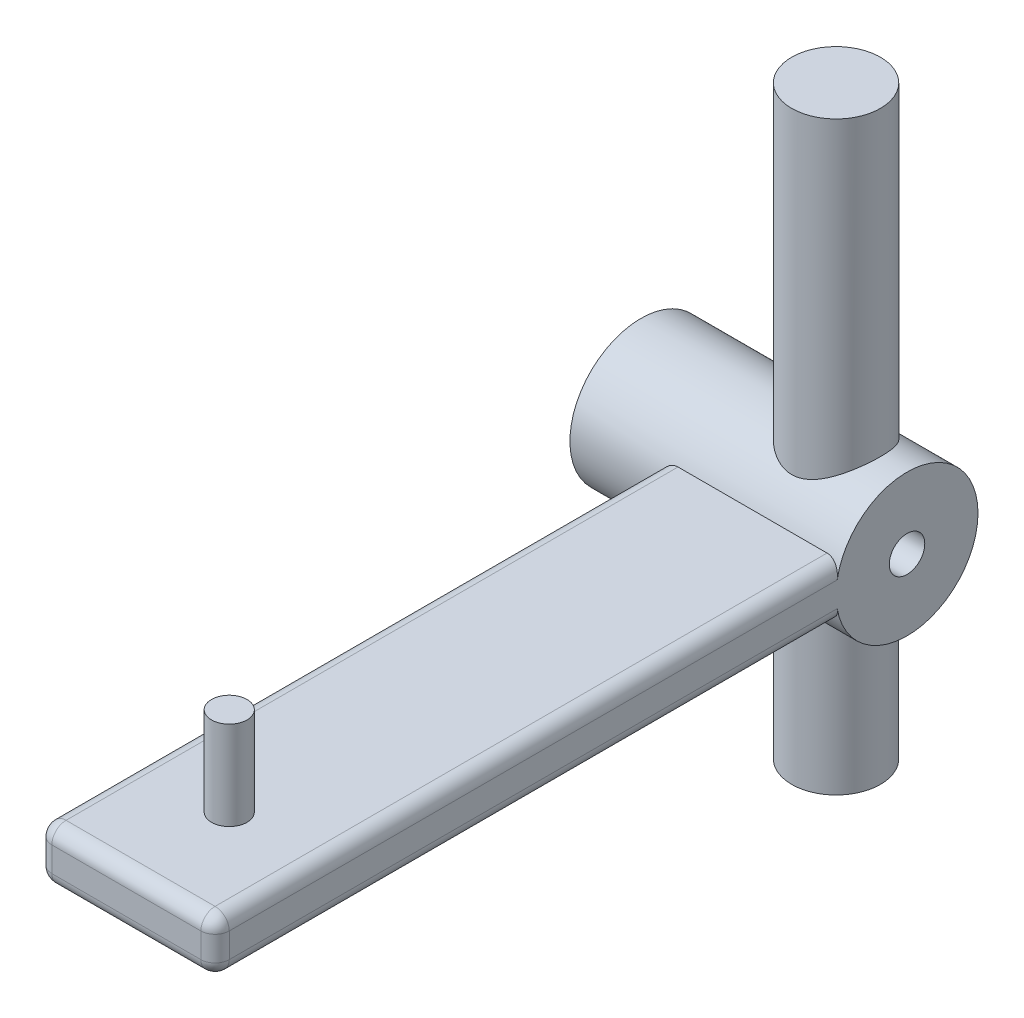
ISO-10303-21;
HEADER;
FILE_DESCRIPTION(('STEP AP214'),'2;1');
FILE_NAME('part.step','',(''),(''),'','','');
FILE_SCHEMA(('AUTOMOTIVE_DESIGN { 1 0 10303 214 1 1 1 1 }'));
ENDSEC;
DATA;
#1=APPLICATION_CONTEXT('core data for automotive mechanical design processes');
#2=APPLICATION_PROTOCOL_DEFINITION('international standard','automotive_design',2000,#1);
#3=PRODUCT_CONTEXT('',#1,'mechanical');
#4=PRODUCT('Part','Part','',(#3));
#5=PRODUCT_RELATED_PRODUCT_CATEGORY('part','',(#4));
#6=PRODUCT_DEFINITION_FORMATION('','',#4);
#7=PRODUCT_DEFINITION_CONTEXT('part definition',#1,'design');
#8=PRODUCT_DEFINITION('design','',#6,#7);
#9=PRODUCT_DEFINITION_SHAPE('','',#8);
#10=(LENGTH_UNIT() NAMED_UNIT(*) SI_UNIT(.MILLI.,.METRE.));
#11=(NAMED_UNIT(*) PLANE_ANGLE_UNIT() SI_UNIT($,.RADIAN.));
#12=(NAMED_UNIT(*) SI_UNIT($,.STERADIAN.) SOLID_ANGLE_UNIT());
#13=UNCERTAINTY_MEASURE_WITH_UNIT(LENGTH_MEASURE(1.E-05),#10,'distance_accuracy_value','');
#14=(GEOMETRIC_REPRESENTATION_CONTEXT(3) GLOBAL_UNCERTAINTY_ASSIGNED_CONTEXT((#13)) GLOBAL_UNIT_ASSIGNED_CONTEXT((#10,
#11,#12)) REPRESENTATION_CONTEXT('',''));
#15=CARTESIAN_POINT('',(0.,0.,0.));
#16=DIRECTION('',(0.,0.,1.));
#17=DIRECTION('',(1.,0.,0.));
#18=AXIS2_PLACEMENT_3D('',#15,#16,#17);
#19=CARTESIAN_POINT('',(15.,0.,0.));
#20=DIRECTION('',(-1.,0.,0.));
#21=DIRECTION('',(0.,0.,1.));
#22=AXIS2_PLACEMENT_3D('',#19,#20,#21);
#23=CYLINDRICAL_SURFACE('',#22,4.);
#24=CARTESIAN_POINT('',(11.,-3.1224989991992,2.5));
#25=CARTESIAN_POINT('',(10.9378432485545,-3.12249991555421,2.4999994109714));
#26=CARTESIAN_POINT('',(10.8756740533292,-3.12436490733917,2.49767581942174));
#27=CARTESIAN_POINT('',(10.7518828204523,-3.13172923119025,2.48843349840857));
#28=CARTESIAN_POINT('',(10.6902611267429,-3.13723070381364,2.48151206248434));
#29=CARTESIAN_POINT('',(10.5067739522563,-3.15888953558504,2.45397595058365));
#30=CARTESIAN_POINT('',(10.386451668811,-3.18020036271142,2.42658990946459));
#31=CARTESIAN_POINT('',(10.1544018021218,-3.23299770760367,2.35576217141198));
#32=CARTESIAN_POINT('',(10.0426095849449,-3.26439575383209,2.31245961359202));
#33=CARTESIAN_POINT('',(9.82799147466594,-3.33366000884439,2.21143916430899));
#34=CARTESIAN_POINT('',(9.72516582624691,-3.37152639405534,2.15372087963018));
#35=CARTESIAN_POINT('',(9.51626601869634,-3.45559225121876,2.01647682425578));
#36=CARTESIAN_POINT('',(9.41160667499548,-3.50222814511578,1.93506425666949));
#37=CARTESIAN_POINT('',(9.2162384483762,-3.59505503533367,1.75662526657432));
#38=CARTESIAN_POINT('',(9.12554172004638,-3.64124561158438,1.65958538899782));
#39=CARTESIAN_POINT('',(8.94977970182732,-3.73459524771314,1.43833990582854));
#40=CARTESIAN_POINT('',(8.86671381554956,-3.78119887781505,1.31226934259652));
#41=CARTESIAN_POINT('',(8.75945484526376,-3.84307251838774,1.11163395543429));
#42=CARTESIAN_POINT('',(8.72658486166689,-3.86236283092052,1.04281240974104));
#43=CARTESIAN_POINT('',(8.66704531463672,-3.89770436975436,0.901758767615551));
#44=CARTESIAN_POINT('',(8.64037146896158,-3.91375783207118,0.829529068393799));
#45=CARTESIAN_POINT('',(8.59601618474372,-3.94066759113823,0.689700297916578));
#46=CARTESIAN_POINT('',(8.57769802348189,-3.95188535984466,0.62237198127859));
#47=CARTESIAN_POINT('',(8.54669771368664,-3.97096241909162,0.485997575898809));
#48=CARTESIAN_POINT('',(8.53401231078379,-3.97882364879721,0.416952503441684));
#49=CARTESIAN_POINT('',(8.51448620236546,-3.99095470334737,0.277765449857175));
#50=CARTESIAN_POINT('',(8.50764188348659,-3.99522674847834,0.207624174243907));
#51=CARTESIAN_POINT('',(8.49990078661077,-4.00006125072438,0.0669114466599394));
#52=CARTESIAN_POINT('',(8.49900332403665,-4.00062413482248,-0.0036599548602787));
#53=CARTESIAN_POINT('',(8.50472537354725,-3.99704479619503,-0.196045081555538));
#54=CARTESIAN_POINT('',(8.51730650307888,-3.98917040897436,-0.317681845488536));
#55=CARTESIAN_POINT('',(8.55973021796612,-3.96290903275931,-0.556636494620256));
#56=CARTESIAN_POINT('',(8.58957410797362,-3.94452124920477,-0.673954052677426));
#57=CARTESIAN_POINT('',(8.66520855928325,-3.89876170711609,-0.901771991763868));
#58=CARTESIAN_POINT('',(8.71103991957106,-3.87136697381047,-1.01225407159607));
#59=CARTESIAN_POINT('',(8.81693723898429,-3.80971291751354,-1.22404012071223));
#60=CARTESIAN_POINT('',(8.87700644106365,-3.77545203089318,-1.32534199174245));
#61=CARTESIAN_POINT('',(9.01805641692367,-3.69786441247167,-1.52942649744659));
#62=CARTESIAN_POINT('',(9.10070927669048,-3.65394006381521,-1.63082454612907));
#63=CARTESIAN_POINT('',(9.28026473720707,-3.56390927740507,-1.81919733573063));
#64=CARTESIAN_POINT('',(9.37718804638397,-3.51779973570409,-1.90615071842624));
#65=CARTESIAN_POINT('',(9.59741125317348,-3.42142883464466,-2.07470887167909));
#66=CARTESIAN_POINT('',(9.72250276335808,-3.37141162686597,-2.15413229677844));
#67=CARTESIAN_POINT('',(9.9872922373014,-3.28028278192382,-2.29052307550563));
#68=CARTESIAN_POINT('',(10.1269626874531,-3.23915480386931,-2.34753179448504));
#69=CARTESIAN_POINT('',(10.3795388061062,-3.18183753131763,-2.42437133527931));
#70=CARTESIAN_POINT('',(10.4898219252135,-3.16193408602513,-2.45003683445404));
#71=CARTESIAN_POINT('',(10.7142303775599,-3.13358277759547,-2.48620337073091));
#72=CARTESIAN_POINT('',(10.8283502426568,-3.12511926504439,-2.49672512520811));
#73=CARTESIAN_POINT('',(11.0574573605024,-3.12092267030677,-2.50197072095181));
#74=CARTESIAN_POINT('',(11.1724460004785,-3.12521876170185,-2.49665835896695));
#75=CARTESIAN_POINT('',(11.3995611643185,-3.14592085836188,-2.47051466367814));
#76=CARTESIAN_POINT('',(11.5116852383712,-3.16233689222906,-2.44967047849126));
#77=CARTESIAN_POINT('',(11.7284367594257,-3.20460120797143,-2.39409874195038));
#78=CARTESIAN_POINT('',(11.8331573158943,-3.23028954367817,-2.35960571424758));
#79=CARTESIAN_POINT('',(12.0355746998938,-3.28831148388749,-2.27804893702243));
#80=CARTESIAN_POINT('',(12.133269018878,-3.32064744602081,-2.23098072583747));
#81=CARTESIAN_POINT('',(12.3386119416632,-3.39574401285203,-2.11530798730694));
#82=CARTESIAN_POINT('',(12.4446145273018,-3.43931724293015,-2.04430931160544));
#83=CARTESIAN_POINT('',(12.6443706606543,-3.52787943213338,-1.8873786892149));
#84=CARTESIAN_POINT('',(12.7381113212423,-3.57286982004467,-1.8014312490262));
#85=CARTESIAN_POINT('',(12.925964070641,-3.66766209459504,-1.60076932492121));
#86=CARTESIAN_POINT('',(13.0177273984849,-3.71707933883201,-1.48365201617177));
#87=CARTESIAN_POINT('',(13.1801470147197,-3.80768973398606,-1.2325678740781));
#88=CARTESIAN_POINT('',(13.2508131951269,-3.84888673619009,-1.09860897940974));
#89=CARTESIAN_POINT('',(13.336581067975,-3.89988966499776,-0.891930804655084));
#90=CARTESIAN_POINT('',(13.3612974439513,-3.91477055097245,-0.824318196039423));
#91=CARTESIAN_POINT('',(13.4049382767323,-3.94124643918619,-0.686640792876425));
#92=CARTESIAN_POINT('',(13.4238660861509,-3.95284334314805,-0.616577444051137));
#93=CARTESIAN_POINT('',(13.4556058301393,-3.9723851203995,-0.474639231464264));
#94=CARTESIAN_POINT('',(13.4684230995164,-3.98033317908836,-0.402766005755507));
#95=CARTESIAN_POINT('',(13.4877391722929,-3.99234168343343,-0.257881807142461));
#96=CARTESIAN_POINT('',(13.4942390209308,-3.99640277220024,-0.184871024482535));
#97=CARTESIAN_POINT('',(13.5030715155071,-4.00191521492706,0.0131102774248925));
#98=CARTESIAN_POINT('',(13.4992657929094,-3.99952706123947,0.13853907920545));
#99=CARTESIAN_POINT('',(13.4730824104545,-3.98321975018363,0.386583137102132));
#100=CARTESIAN_POINT('',(13.4507055933212,-3.96930111604857,0.509198520626831));
#101=CARTESIAN_POINT('',(13.3896775844539,-3.93192083384285,0.744080605483849));
#102=CARTESIAN_POINT('',(13.3516179264353,-3.90880701054803,0.856558752631811));
#103=CARTESIAN_POINT('',(13.2608805375565,-3.85489971248843,1.07343034721918));
#104=CARTESIAN_POINT('',(13.2082003404328,-3.82410494215309,1.17782242685802));
#105=CARTESIAN_POINT('',(13.08367872128,-3.75350673935648,1.38731297754797));
#106=CARTESIAN_POINT('',(13.0104160092425,-3.71310001864657,1.4913601218378));
#107=CARTESIAN_POINT('',(12.8498467674859,-3.62867283985206,1.68643334934802));
#108=CARTESIAN_POINT('',(12.7625243911657,-3.58464833191203,1.77744451843681));
#109=CARTESIAN_POINT('',(12.5617674849381,-3.49000828219719,1.95744716561589));
#110=CARTESIAN_POINT('',(12.4463833874286,-3.43935738427104,2.04425661250063));
#111=CARTESIAN_POINT('',(12.2007105902402,-3.34349647457112,2.19754648509904));
#112=CARTESIAN_POINT('',(12.0704301888475,-3.2982834620419,2.26403815415028));
#113=CARTESIAN_POINT('',(11.8271946992151,-3.22859539780091,2.3619822941284));
#114=CARTESIAN_POINT('',(11.7167294278464,-3.20174639338769,2.39792458576829));
#115=CARTESIAN_POINT('',(11.4900606569982,-3.1587835810451,2.45425618419746));
#116=CARTESIAN_POINT('',(11.3738765802003,-3.14263581150428,2.47469472410168));
#117=CARTESIAN_POINT('',(11.2139400053539,-3.12952857640607,2.49119847139522));
#118=CARTESIAN_POINT('',(11.1712744742913,-3.1268999430677,2.4944943383796));
#119=CARTESIAN_POINT('',(11.0857413010483,-3.12338461939862,2.49889558125807));
#120=CARTESIAN_POINT('',(11.0428736107566,-3.12249836712871,2.50000040629188));
#121=CARTESIAN_POINT('',(11.,-3.1224989991992,2.5));
#122=B_SPLINE_CURVE_WITH_KNOTS('',3,(#24,#25,#26,#27,#28,#29,#30,#31,#32,#33,#34,#35,#36,#37,
#38,#39,#40,#41,#42,#43,#44,#45,#46,#47,#48,#49,#50,#51,#52,#53,#54,#55,#56,#57,#58,#59,#60,#61,
#62,#63,#64,#65,#66,#67,#68,#69,#70,#71,#72,#73,#74,#75,#76,#77,#78,#79,#80,#81,#82,#83,#84,#85,
#86,#87,#88,#89,#90,#91,#92,#93,#94,#95,#96,#97,#98,#99,#100,#101,#102,#103,#104,#105,#106,#107,
#108,#109,#110,#111,#112,#113,#114,#115,#116,#117,#118,#119,#120,#121),.UNSPECIFIED.,.T.,.F.,(4,
2,2,2,2,2,2,2,2,2,2,2,2,2,2,2,2,2,2,2,2,2,2,2,2,2,2,2,2,2,2,2,2,2,2,2,2,2,2,2,2,2,2,2,2,2,2,2,
4),(0.,0.186415315858459,0.372940459994496,0.746478880764687,1.11682668423133,1.48718459072605,
1.90722798685071,2.32763499192879,2.7987602926597,3.03445880867314,3.26999394209509,
3.48170145743206,3.69328649746504,3.90474055342595,4.11617026725867,4.48184709708114,
4.8475515669392,5.21419620193005,5.58092442797435,5.99329080205308,6.40626158573465,
6.87316206383506,7.33919680735487,7.68265621505466,8.02564530559509,8.36941921026408,
8.71347788865091,9.05186495232126,9.39037223519201,9.79332737765188,10.1967026751544,
10.6647326786671,11.1325428866819,11.3527929661039,11.5729152387447,11.7928449800804,
12.0127383271002,12.3871595324234,12.7615637480926,13.1229788842094,13.4844550226785,
13.8834503840958,14.2828986410983,14.7399238503459,15.1966956936287,15.5530255473292,
15.9082190611887,16.0367696833385,16.1653526209168),.UNSPECIFIED.);
#123=CARTESIAN_POINT('',(11.,-3.1224989991992,2.5));
#124=VERTEX_POINT('',#123);
#125=EDGE_CURVE('E43',#124,#124,#122,.T.);
#126=ORIENTED_EDGE('',*,*,#125,.F.);
#127=EDGE_LOOP('',(#126));
#128=FACE_BOUND('',#127,.T.);
#129=CARTESIAN_POINT('',(11.,3.1224989991992,2.5));
#130=CARTESIAN_POINT('',(11.0621567514455,3.12249991555421,2.4999994109714));
#131=CARTESIAN_POINT('',(11.1243259466708,3.12436490733916,2.49767581942174));
#132=CARTESIAN_POINT('',(11.2481171795477,3.13172923119025,2.48843349840857));
#133=CARTESIAN_POINT('',(11.3097388732571,3.13723070381364,2.48151206248434));
#134=CARTESIAN_POINT('',(11.4932260477437,3.15888953558504,2.45397595058365));
#135=CARTESIAN_POINT('',(11.613548331189,3.18020036271142,2.4265899094646));
#136=CARTESIAN_POINT('',(11.8455981978782,3.23299770760367,2.35576217141198));
#137=CARTESIAN_POINT('',(11.9573904150551,3.26439575383209,2.31245961359202));
#138=CARTESIAN_POINT('',(12.1720085253341,3.33366000884439,2.21143916430899));
#139=CARTESIAN_POINT('',(12.2748341737531,3.37152639405534,2.15372087963018));
#140=CARTESIAN_POINT('',(12.4837339813037,3.45559225121876,2.01647682425578));
#141=CARTESIAN_POINT('',(12.5883933250045,3.50222814511578,1.93506425666949));
#142=CARTESIAN_POINT('',(12.7837615516238,3.59505503533367,1.75662526657432));
#143=CARTESIAN_POINT('',(12.8744582799536,3.64124561158438,1.65958538899782));
#144=CARTESIAN_POINT('',(13.0502202981727,3.73459524771314,1.43833990582854));
#145=CARTESIAN_POINT('',(13.1332861844504,3.78119887781505,1.31226934259652));
#146=CARTESIAN_POINT('',(13.2405451547362,3.84307251838774,1.11163395543429));
#147=CARTESIAN_POINT('',(13.2734151383331,3.86236283092052,1.04281240974104));
#148=CARTESIAN_POINT('',(13.3329546853633,3.89770436975436,0.901758767615551));
#149=CARTESIAN_POINT('',(13.3596285310384,3.91375783207118,0.829529068393799));
#150=CARTESIAN_POINT('',(13.4039838152563,3.94066759113823,0.689700297916579));
#151=CARTESIAN_POINT('',(13.4223019765181,3.95188535984466,0.622371981278591));
#152=CARTESIAN_POINT('',(13.4533022863134,3.97096241909162,0.485997575898811));
#153=CARTESIAN_POINT('',(13.4659876892162,3.97882364879721,0.416952503441685));
#154=CARTESIAN_POINT('',(13.4855137976345,3.99095470334737,0.277765449857176));
#155=CARTESIAN_POINT('',(13.4923581165134,3.99522674847834,0.207624174243907));
#156=CARTESIAN_POINT('',(13.5000992133892,4.00006125072438,0.0669114466599402));
#157=CARTESIAN_POINT('',(13.5009966759634,4.00062413482248,-0.00365995486027784));
#158=CARTESIAN_POINT('',(13.4952746264528,3.99704479619503,-0.196045081555537));
#159=CARTESIAN_POINT('',(13.4826934969211,3.98917040897436,-0.317681845488535));
#160=CARTESIAN_POINT('',(13.4402697820339,3.96290903275931,-0.556636494620255));
#161=CARTESIAN_POINT('',(13.4104258920264,3.94452124920478,-0.673954052677426));
#162=CARTESIAN_POINT('',(13.3347914407167,3.89876170711609,-0.901771991763867));
#163=CARTESIAN_POINT('',(13.2889600804289,3.87136697381047,-1.01225407159606));
#164=CARTESIAN_POINT('',(13.1830627610157,3.80971291751354,-1.22404012071223));
#165=CARTESIAN_POINT('',(13.1229935589364,3.77545203089318,-1.32534199174245));
#166=CARTESIAN_POINT('',(12.9819435830763,3.69786441247167,-1.52942649744659));
#167=CARTESIAN_POINT('',(12.8992907233095,3.65394006381521,-1.63082454612907));
#168=CARTESIAN_POINT('',(12.7197352627929,3.56390927740507,-1.81919733573063));
#169=CARTESIAN_POINT('',(12.622811953616,3.51779973570409,-1.90615071842624));
#170=CARTESIAN_POINT('',(12.4025887468265,3.42142883464466,-2.07470887167909));
#171=CARTESIAN_POINT('',(12.2774972366419,3.37141162686597,-2.15413229677844));
#172=CARTESIAN_POINT('',(12.0127077626986,3.28028278192382,-2.29052307550563));
#173=CARTESIAN_POINT('',(11.8730373125469,3.23915480386931,-2.34753179448504));
#174=CARTESIAN_POINT('',(11.6204611938938,3.18183753131763,-2.42437133527931));
#175=CARTESIAN_POINT('',(11.5101780747865,3.16193408602513,-2.45003683445404));
#176=CARTESIAN_POINT('',(11.2857696224401,3.13358277759547,-2.48620337073091));
#177=CARTESIAN_POINT('',(11.1716497573432,3.12511926504439,-2.49672512520811));
#178=CARTESIAN_POINT('',(10.9425426394976,3.12092267030677,-2.50197072095181));
#179=CARTESIAN_POINT('',(10.8275539995215,3.12521876170185,-2.49665835896695));
#180=CARTESIAN_POINT('',(10.6004388356815,3.14592085836188,-2.47051466367814));
#181=CARTESIAN_POINT('',(10.4883147616288,3.16233689222906,-2.44967047849126));
#182=CARTESIAN_POINT('',(10.2715632405743,3.20460120797143,-2.39409874195038));
#183=CARTESIAN_POINT('',(10.1668426841057,3.23028954367817,-2.35960571424758));
#184=CARTESIAN_POINT('',(9.96442530010621,3.28831148388749,-2.27804893702243));
#185=CARTESIAN_POINT('',(9.86673098112203,3.32064744602081,-2.23098072583747));
#186=CARTESIAN_POINT('',(9.66138805833681,3.39574401285203,-2.11530798730694));
#187=CARTESIAN_POINT('',(9.55538547269823,3.43931724293015,-2.04430931160544));
#188=CARTESIAN_POINT('',(9.35562933934573,3.52787943213338,-1.88737868921489));
#189=CARTESIAN_POINT('',(9.26188867875766,3.57286982004467,-1.8014312490262));
#190=CARTESIAN_POINT('',(9.07403592935904,3.66766209459505,-1.60076932492121));
#191=CARTESIAN_POINT('',(8.98227260151509,3.71707933883201,-1.48365201617177));
#192=CARTESIAN_POINT('',(8.81985298528028,3.80768973398606,-1.23256787407809));
#193=CARTESIAN_POINT('',(8.74918680487308,3.84888673619009,-1.09860897940974));
#194=CARTESIAN_POINT('',(8.66341893202501,3.89988966499776,-0.89193080465508));
#195=CARTESIAN_POINT('',(8.63870255604872,3.91477055097245,-0.824318196039419));
#196=CARTESIAN_POINT('',(8.59506172326772,3.94124643918619,-0.686640792876421));
#197=CARTESIAN_POINT('',(8.57613391384908,3.95284334314805,-0.616577444051133));
#198=CARTESIAN_POINT('',(8.54439416986074,3.9723851203995,-0.474639231464261));
#199=CARTESIAN_POINT('',(8.53157690048357,3.98033317908836,-0.402766005755505));
#200=CARTESIAN_POINT('',(8.5122608277071,3.99234168343343,-0.257881807142459));
#201=CARTESIAN_POINT('',(8.50576097906921,3.99640277220024,-0.184871024482533));
#202=CARTESIAN_POINT('',(8.49692848449289,4.00191521492706,0.0131102774248941));
#203=CARTESIAN_POINT('',(8.50073420709059,3.99952706123947,0.138539079205451));
#204=CARTESIAN_POINT('',(8.52691758954553,3.98321975018363,0.386583137102133));
#205=CARTESIAN_POINT('',(8.5492944066788,3.96930111604857,0.509198520626833));
#206=CARTESIAN_POINT('',(8.61032241554611,3.93192083384285,0.744080605483852));
#207=CARTESIAN_POINT('',(8.64838207356467,3.90880701054803,0.856558752631814));
#208=CARTESIAN_POINT('',(8.73911946244348,3.85489971248843,1.07343034721918));
#209=CARTESIAN_POINT('',(8.7917996595672,3.82410494215309,1.17782242685803));
#210=CARTESIAN_POINT('',(8.91632127871996,3.75350673935648,1.38731297754798));
#211=CARTESIAN_POINT('',(8.9895839907575,3.71310001864657,1.4913601218378));
#212=CARTESIAN_POINT('',(9.1501532325141,3.62867283985206,1.68643334934803));
#213=CARTESIAN_POINT('',(9.23747560883428,3.58464833191203,1.77744451843681));
#214=CARTESIAN_POINT('',(9.43823251506187,3.49000828219718,1.95744716561589));
#215=CARTESIAN_POINT('',(9.55361661257142,3.43935738427104,2.04425661250064));
#216=CARTESIAN_POINT('',(9.79928940975976,3.34349647457112,2.19754648509905));
#217=CARTESIAN_POINT('',(9.92956981115252,3.2982834620419,2.26403815415028));
#218=CARTESIAN_POINT('',(10.1728053007849,3.22859539780091,2.36198229412841));
#219=CARTESIAN_POINT('',(10.2832705721536,3.20174639338769,2.3979245857683));
#220=CARTESIAN_POINT('',(10.5099393430018,3.1587835810451,2.45425618419746));
#221=CARTESIAN_POINT('',(10.6261234197997,3.14263581150428,2.47469472410168));
#222=CARTESIAN_POINT('',(10.7860599946461,3.12952857640607,2.49119847139522));
#223=CARTESIAN_POINT('',(10.8287255257087,3.1268999430677,2.4944943383796));
#224=CARTESIAN_POINT('',(10.9142586989517,3.12338461939862,2.49889558125807));
#225=CARTESIAN_POINT('',(10.9571263892434,3.12249836712871,2.50000040629188));
#226=CARTESIAN_POINT('',(11.,3.1224989991992,2.5));
#227=B_SPLINE_CURVE_WITH_KNOTS('',3,(#129,#130,#131,#132,#133,#134,#135,#136,#137,#138,#139,
#140,#141,#142,#143,#144,#145,#146,#147,#148,#149,#150,#151,#152,#153,#154,#155,#156,#157,#158,
#159,#160,#161,#162,#163,#164,#165,#166,#167,#168,#169,#170,#171,#172,#173,#174,#175,#176,#177,
#178,#179,#180,#181,#182,#183,#184,#185,#186,#187,#188,#189,#190,#191,#192,#193,#194,#195,#196,
#197,#198,#199,#200,#201,#202,#203,#204,#205,#206,#207,#208,#209,#210,#211,#212,#213,#214,#215,
#216,#217,#218,#219,#220,#221,#222,#223,#224,#225,#226),.UNSPECIFIED.,.T.,.F.,(4,2,2,2,2,2,2,2,
2,2,2,2,2,2,2,2,2,2,2,2,2,2,2,2,2,2,2,2,2,2,2,2,2,2,2,2,2,2,2,2,2,2,2,2,2,2,2,2,4),(0.,
0.186415315858459,0.372940459994496,0.746478880764687,1.11682668423133,1.48718459072605,
1.90722798685071,2.32763499192879,2.7987602926597,3.03445880867314,3.26999394209509,
3.48170145743206,3.69328649746504,3.90474055342595,4.11617026725867,4.48184709708114,
4.84755156693919,5.21419620193005,5.58092442797435,5.99329080205308,6.40626158573465,
6.87316206383506,7.33919680735487,7.68265621505467,8.02564530559509,8.36941921026408,
8.71347788865091,9.05186495232127,9.39037223519201,9.79332737765188,10.1967026751544,
10.6647326786671,11.1325428866819,11.3527929661039,11.5729152387447,11.7928449800804,
12.0127383271002,12.3871595324234,12.7615637480926,13.1229788842094,13.4844550226785,
13.8834503840959,14.2828986410983,14.7399238503459,15.1966956936287,15.5530255473292,
15.9082190611887,16.0367696833385,16.1653526209168),.UNSPECIFIED.);
#228=CARTESIAN_POINT('',(11.,3.1224989991992,2.5));
#229=VERTEX_POINT('',#228);
#230=EDGE_CURVE('E258',#229,#229,#227,.T.);
#231=ORIENTED_EDGE('',*,*,#230,.F.);
#232=EDGE_LOOP('',(#231));
#233=FACE_BOUND('',#232,.T.);
#234=CARTESIAN_POINT('',(0.,0.,0.));
#235=DIRECTION('',(1.,0.,0.));
#236=DIRECTION('',(0.,0.,-1.));
#237=AXIS2_PLACEMENT_3D('',#234,#235,#236);
#238=CIRCLE('',#237,4.);
#239=CARTESIAN_POINT('',(0.,0.,-4.));
#240=VERTEX_POINT('',#239);
#241=EDGE_CURVE('E313',#240,#240,#238,.T.);
#242=ORIENTED_EDGE('',*,*,#241,.T.);
#243=EDGE_LOOP('',(#242));
#244=FACE_BOUND('',#243,.T.);
#245=DIRECTION('',(-1.,0.,0.));
#246=VECTOR('',#245,1.);
#247=CARTESIAN_POINT('',(15.,1.5,3.70809924354783));
#248=LINE('',#247,#246);
#249=CARTESIAN_POINT('',(14.2,1.5,3.70809924354783));
#250=VERTEX_POINT('',#249);
#251=CARTESIAN_POINT('',(5.8,1.5,3.70809924354783));
#252=VERTEX_POINT('',#251);
#253=EDGE_CURVE('E315',#250,#252,#248,.T.);
#254=ORIENTED_EDGE('',*,*,#253,.F.);
#255=CARTESIAN_POINT('',(15.,0.7,3.93827373350304));
#256=CARTESIAN_POINT('',(15.00003157772,0.746057399138449,3.9301179800702));
#257=CARTESIAN_POINT('',(14.9960258857976,0.791919933036745,3.92110328681089));
#258=CARTESIAN_POINT('',(14.9803588367309,0.881961921379461,3.90181942675969));
#259=CARTESIAN_POINT('',(14.9687114719594,0.926144296163572,3.89155258065569));
#260=CARTESIAN_POINT('',(14.9381838912962,1.01169058580803,3.8701995381054));
#261=CARTESIAN_POINT('',(14.9193068997385,1.05305574744176,3.85911370869303));
#262=CARTESIAN_POINT('',(14.8748698776604,1.13197362371854,3.83670636777501));
#263=CARTESIAN_POINT('',(14.8493073076953,1.16952488215088,3.82538476822184));
#264=CARTESIAN_POINT('',(14.7915279549102,1.24058836091228,3.80294105508851));
#265=CARTESIAN_POINT('',(14.7591829110673,1.27399940690902,3.79182809884115));
#266=CARTESIAN_POINT('',(14.6889567532844,1.33488571743998,3.77082476988019));
#267=CARTESIAN_POINT('',(14.6510752552896,1.36236056986213,3.76093448206906));
#268=CARTESIAN_POINT('',(14.5714787449458,1.41001168712396,3.74332778635944));
#269=CARTESIAN_POINT('',(14.5298458580468,1.43031145292343,3.73557515688311));
#270=CARTESIAN_POINT('',(14.4433668611617,1.46348478454338,3.72270502847047));
#271=CARTESIAN_POINT('',(14.3985257803724,1.47636969911195,3.7175835038112));
#272=CARTESIAN_POINT('',(14.3277042185887,1.49015791918636,3.71206891089618));
#273=CARTESIAN_POINT('',(14.3023185499099,1.4938437850753,3.7105851362699));
#274=CARTESIAN_POINT('',(14.2512938265108,1.49876515548529,3.70859889809295));
#275=CARTESIAN_POINT('',(14.2256549923322,1.50000263111689,3.70809564516465));
#276=CARTESIAN_POINT('',(14.2,1.5,3.70809924354783));
#277=B_SPLINE_CURVE_WITH_KNOTS('',3,(#255,#256,#257,#258,#259,#260,#261,#262,#263,#264,#265,
#266,#267,#268,#269,#270,#271,#272,#273,#274,#275,#276),.UNSPECIFIED.,.F.,.F.,(4,2,2,2,2,2,2,2,
2,2,4),(0.,0.140082306408202,0.279908826688306,0.419673058359881,0.559490455259687,
0.702238898420923,0.844997248514572,0.985162666955398,1.12511298169198,1.20207417653242,
1.2789733874432),.UNSPECIFIED.);
#278=CARTESIAN_POINT('',(15.,0.7,3.93827373350304));
#279=VERTEX_POINT('',#278);
#280=EDGE_CURVE('E318',#279,#250,#277,.T.);
#281=ORIENTED_EDGE('',*,*,#280,.F.);
#282=CARTESIAN_POINT('',(15.,0.,0.));
#283=DIRECTION('',(1.,0.,0.));
#284=DIRECTION('',(0.,0.,-1.));
#285=AXIS2_PLACEMENT_3D('',#282,#283,#284);
#286=CIRCLE('',#285,4.);
#287=CARTESIAN_POINT('',(15.,-0.700000000000001,3.93827373350304));
#288=VERTEX_POINT('',#287);
#289=EDGE_CURVE('E574',#288,#279,#286,.T.);
#290=ORIENTED_EDGE('',*,*,#289,.F.);
#291=CARTESIAN_POINT('',(14.2,-1.5,3.70809924354783));
#292=CARTESIAN_POINT('',(14.2215067926189,-1.50000073352804,3.70809778661657));
#293=CARTESIAN_POINT('',(14.2430025923986,-1.4991321493973,3.70845042333593));
#294=CARTESIAN_POINT('',(14.2858267718489,-1.49567285274098,3.70984742730189));
#295=CARTESIAN_POINT('',(14.3071551954586,-1.49308260860119,3.71089160641082));
#296=CARTESIAN_POINT('',(14.370514093532,-1.48278184734816,3.71502567016665));
#297=CARTESIAN_POINT('',(14.4120980203134,-1.47254098080252,3.71911736223386));
#298=CARTESIAN_POINT('',(14.4927885000183,-1.44571117153796,3.72962779242602));
#299=CARTESIAN_POINT('',(14.5318964495163,-1.42912584526848,3.73604520474161));
#300=CARTESIAN_POINT('',(14.6067597673662,-1.39016517268406,3.75071632174409));
#301=CARTESIAN_POINT('',(14.6425130168298,-1.3677862000954,3.75897117604025));
#302=CARTESIAN_POINT('',(14.7111999715858,-1.31690610145354,3.77710394197983));
#303=CARTESIAN_POINT('',(14.7439666998481,-1.28819820525238,3.78703305394968));
#304=CARTESIAN_POINT('',(14.8043253799727,-1.2259944621487,3.80762528162875));
#305=CARTESIAN_POINT('',(14.8319153980565,-1.19249683422573,3.8182886696041));
#306=CARTESIAN_POINT('',(14.8827532800253,-1.11945301490267,3.84035953031236));
#307=CARTESIAN_POINT('',(14.9056564658015,-1.07966868700776,3.85177428699458));
#308=CARTESIAN_POINT('',(14.94436800161,-0.996666323576232,3.87408054799547));
#309=CARTESIAN_POINT('',(14.9601804904175,-0.953450308470307,3.88497235423147));
#310=CARTESIAN_POINT('',(14.9813684306612,-0.875203805486262,3.90323289951199));
#311=CARTESIAN_POINT('',(14.9883258777497,-0.840646635238305,3.9108266982797));
#312=CARTESIAN_POINT('',(14.9976456259015,-0.770763840123243,3.9252026706308));
#313=CARTESIAN_POINT('',(15.0000090815126,-0.735438410589979,3.93198504773597));
#314=CARTESIAN_POINT('',(15.,-0.700000000000001,3.93827373350304));
#315=B_SPLINE_CURVE_WITH_KNOTS('',3,(#291,#292,#293,#294,#295,#296,#297,#298,#299,#300,#301,
#302,#303,#304,#305,#306,#307,#308,#309,#310,#311,#312,#313,#314),.UNSPECIFIED.,.F.,.F.,(4,2,2,
2,2,2,2,2,2,2,2,4),(0.,0.0644784976977748,0.128939460889541,0.257329137725427,0.385645739062586,
0.514042849430028,0.647507573380535,0.781022054723122,0.922280736105957,1.06345685841978,
1.17133689581842,1.27918981762996),.UNSPECIFIED.);
#316=CARTESIAN_POINT('',(14.2,-1.5,3.70809924354783));
#317=VERTEX_POINT('',#316);
#318=EDGE_CURVE('E219',#317,#288,#315,.T.);
#319=ORIENTED_EDGE('',*,*,#318,.F.);
#320=DIRECTION('',(-1.,0.,0.));
#321=VECTOR('',#320,1.);
#322=CARTESIAN_POINT('',(15.,-1.5,3.70809924354783));
#323=LINE('',#322,#321);
#324=CARTESIAN_POINT('',(5.8,-1.5,3.70809924354783));
#325=VERTEX_POINT('',#324);
#326=EDGE_CURVE('E207',#325,#317,#323,.F.);
#327=ORIENTED_EDGE('',*,*,#326,.F.);
#328=CARTESIAN_POINT('',(5.,-0.700000000000003,3.93827373350304));
#329=CARTESIAN_POINT('',(4.99996842228003,-0.746057399138452,3.9301179800702));
#330=CARTESIAN_POINT('',(5.00397411420245,-0.791919933036747,3.92110328681089));
#331=CARTESIAN_POINT('',(5.01964116326913,-0.881961921379462,3.90181942675969));
#332=CARTESIAN_POINT('',(5.03128852804058,-0.926144296163574,3.89155258065569));
#333=CARTESIAN_POINT('',(5.06181610870384,-1.01169058580803,3.8701995381054));
#334=CARTESIAN_POINT('',(5.08069310026154,-1.05305574744177,3.85911370869303));
#335=CARTESIAN_POINT('',(5.12513012233964,-1.13197362371854,3.83670636777501));
#336=CARTESIAN_POINT('',(5.15069269230468,-1.16952488215088,3.82538476822183));
#337=CARTESIAN_POINT('',(5.20847204508982,-1.24058836091228,3.80294105508851));
#338=CARTESIAN_POINT('',(5.24081708893271,-1.27399940690902,3.79182809884115));
#339=CARTESIAN_POINT('',(5.31104324671558,-1.33488571743998,3.77082476988019));
#340=CARTESIAN_POINT('',(5.34892474471042,-1.36236056986213,3.76093448206906));
#341=CARTESIAN_POINT('',(5.42852125505425,-1.41001168712396,3.74332778635944));
#342=CARTESIAN_POINT('',(5.47015414195316,-1.43031145292343,3.73557515688311));
#343=CARTESIAN_POINT('',(5.55663313883834,-1.46348478454338,3.72270502847047));
#344=CARTESIAN_POINT('',(5.60147421962762,-1.47636969911195,3.7175835038112));
#345=CARTESIAN_POINT('',(5.67229578141132,-1.49015791918636,3.71206891089618));
#346=CARTESIAN_POINT('',(5.69768145009014,-1.4938437850753,3.7105851362699));
#347=CARTESIAN_POINT('',(5.7487061734892,-1.49876515548529,3.70859889809294));
#348=CARTESIAN_POINT('',(5.7743450076678,-1.50000263111689,3.70809564516464));
#349=CARTESIAN_POINT('',(5.8,-1.5,3.70809924354783));
#350=B_SPLINE_CURVE_WITH_KNOTS('',3,(#328,#329,#330,#331,#332,#333,#334,#335,#336,#337,#338,
#339,#340,#341,#342,#343,#344,#345,#346,#347,#348,#349),.UNSPECIFIED.,.F.,.F.,(4,2,2,2,2,2,2,2,
2,2,4),(0.,0.140082306408202,0.279908826688306,0.419673058359881,0.559490455259687,
0.702238898420922,0.844997248514571,0.985162666955397,1.12511298169198,1.20207417653242,
1.2789733874432),.UNSPECIFIED.);
#351=CARTESIAN_POINT('',(5.,-0.700000000000003,3.93827373350304));
#352=VERTEX_POINT('',#351);
#353=EDGE_CURVE('E197',#352,#325,#350,.T.);
#354=ORIENTED_EDGE('',*,*,#353,.F.);
#355=CARTESIAN_POINT('',(5.,0.,0.));
#356=DIRECTION('',(-1.,0.,0.));
#357=DIRECTION('',(0.,0.,1.));
#358=AXIS2_PLACEMENT_3D('',#355,#356,#357);
#359=CIRCLE('',#358,4.);
#360=CARTESIAN_POINT('',(5.,0.699999999999998,3.93827373350304));
#361=VERTEX_POINT('',#360);
#362=EDGE_CURVE('E194',#361,#352,#359,.F.);
#363=ORIENTED_EDGE('',*,*,#362,.F.);
#364=CARTESIAN_POINT('',(5.8,1.5,3.70809924354783));
#365=CARTESIAN_POINT('',(5.77849320738113,1.50000073352804,3.70809778661657));
#366=CARTESIAN_POINT('',(5.75699740760135,1.4991321493973,3.70845042333593));
#367=CARTESIAN_POINT('',(5.71417322815106,1.49567285274097,3.70984742730189));
#368=CARTESIAN_POINT('',(5.69284480454142,1.49308260860118,3.71089160641082));
#369=CARTESIAN_POINT('',(5.62948590646802,1.48278184734816,3.71502567016665));
#370=CARTESIAN_POINT('',(5.58790197968659,1.47254098080252,3.71911736223386));
#371=CARTESIAN_POINT('',(5.5072114999817,1.44571117153796,3.72962779242602));
#372=CARTESIAN_POINT('',(5.46810355048368,1.42912584526848,3.73604520474161));
#373=CARTESIAN_POINT('',(5.39324023263384,1.39016517268405,3.7507163217441));
#374=CARTESIAN_POINT('',(5.35748698317021,1.3677862000954,3.75897117604025));
#375=CARTESIAN_POINT('',(5.28880002841422,1.31690610145353,3.77710394197983));
#376=CARTESIAN_POINT('',(5.25603330015186,1.28819820525237,3.78703305394968));
#377=CARTESIAN_POINT('',(5.19567462002726,1.2259944621487,3.80762528162874));
#378=CARTESIAN_POINT('',(5.16808460194347,1.19249683422572,3.8182886696041));
#379=CARTESIAN_POINT('',(5.11724671997468,1.11945301490267,3.84035953031236));
#380=CARTESIAN_POINT('',(5.09434353419854,1.07966868700776,3.85177428699458));
#381=CARTESIAN_POINT('',(5.05563199839,0.996666323576232,3.87408054799547));
#382=CARTESIAN_POINT('',(5.03981950958251,0.953450308470307,3.88497235423147));
#383=CARTESIAN_POINT('',(5.01863156933884,0.875203805486261,3.90323289951199));
#384=CARTESIAN_POINT('',(5.0116741222503,0.840646635238304,3.9108266982797));
#385=CARTESIAN_POINT('',(5.00235437409852,0.770763840123241,3.9252026706308));
#386=CARTESIAN_POINT('',(4.99999091848744,0.735438410589977,3.93198504773597));
#387=CARTESIAN_POINT('',(5.,0.699999999999998,3.93827373350304));
#388=B_SPLINE_CURVE_WITH_KNOTS('',3,(#364,#365,#366,#367,#368,#369,#370,#371,#372,#373,#374,
#375,#376,#377,#378,#379,#380,#381,#382,#383,#384,#385,#386,#387),.UNSPECIFIED.,.F.,.F.,(4,2,2,
2,2,2,2,2,2,2,2,4),(0.,0.0644784976977748,0.128939460889539,0.257329137725425,0.385645739062581,
0.514042849430024,0.64750757338053,0.781022054723119,0.922280736105953,1.06345685841978,
1.17133689581842,1.27918981762996),.UNSPECIFIED.);
#389=EDGE_CURVE('E126',#252,#361,#388,.T.);
#390=ORIENTED_EDGE('',*,*,#389,.F.);
#391=EDGE_LOOP('',(#254,#281,#290,#319,#327,#354,#363,#390));
#392=FACE_BOUND('',#391,.T.);
#393=ADVANCED_FACE('F35',(#128,#233,#244,#392),#23,.T.);
#394=CARTESIAN_POINT('',(15.,0.,0.));
#395=DIRECTION('',(-1.,0.,0.));
#396=DIRECTION('',(0.,0.,1.));
#397=AXIS2_PLACEMENT_3D('',#394,#395,#396);
#398=CYLINDRICAL_SURFACE('',#397,1.);
#399=CARTESIAN_POINT('',(0.,0.,0.));
#400=DIRECTION('',(1.,0.,0.));
#401=DIRECTION('',(0.,0.,-1.));
#402=AXIS2_PLACEMENT_3D('',#399,#400,#401);
#403=CIRCLE('',#402,1.);
#404=CARTESIAN_POINT('',(0.,0.,-1.));
#405=VERTEX_POINT('',#404);
#406=EDGE_CURVE('E264',#405,#405,#403,.T.);
#407=ORIENTED_EDGE('',*,*,#406,.F.);
#408=EDGE_LOOP('',(#407));
#409=FACE_BOUND('',#408,.T.);
#410=CARTESIAN_POINT('',(15.,0.,0.));
#411=DIRECTION('',(1.,0.,0.));
#412=DIRECTION('',(0.,0.,-1.));
#413=AXIS2_PLACEMENT_3D('',#410,#411,#412);
#414=CIRCLE('',#413,1.);
#415=CARTESIAN_POINT('',(15.,0.,-1.));
#416=VERTEX_POINT('',#415);
#417=EDGE_CURVE('E570',#416,#416,#414,.T.);
#418=ORIENTED_EDGE('',*,*,#417,.T.);
#419=EDGE_LOOP('',(#418));
#420=FACE_BOUND('',#419,.T.);
#421=ADVANCED_FACE('F249',(#409,#420),#398,.F.);
#422=CARTESIAN_POINT('',(15.,0.,0.));
#423=DIRECTION('',(1.,0.,0.));
#424=DIRECTION('',(0.,0.,-1.));
#425=AXIS2_PLACEMENT_3D('',#422,#423,#424);
#426=PLANE('',#425);
#427=ORIENTED_EDGE('',*,*,#289,.T.);
#428=DIRECTION('',(0.,0.,-1.));
#429=VECTOR('',#428,1.);
#430=CARTESIAN_POINT('',(15.,0.7,39.));
#431=LINE('',#430,#429);
#432=CARTESIAN_POINT('',(15.,0.7,38.2));
#433=VERTEX_POINT('',#432);
#434=EDGE_CURVE('E153',#279,#433,#431,.F.);
#435=ORIENTED_EDGE('',*,*,#434,.T.);
#436=DIRECTION('',(0.,1.,0.));
#437=VECTOR('',#436,1.);
#438=CARTESIAN_POINT('',(15.,1.5,38.2));
#439=LINE('',#438,#437);
#440=CARTESIAN_POINT('',(15.,-0.700000000000001,38.2));
#441=VERTEX_POINT('',#440);
#442=EDGE_CURVE('E122',#433,#441,#439,.F.);
#443=ORIENTED_EDGE('',*,*,#442,.T.);
#444=DIRECTION('',(0.,0.,1.));
#445=VECTOR('',#444,1.);
#446=CARTESIAN_POINT('',(15.,-0.700000000000001,-4.001));
#447=LINE('',#446,#445);
#448=EDGE_CURVE('E170',#288,#441,#447,.T.);
#449=ORIENTED_EDGE('',*,*,#448,.F.);
#450=EDGE_LOOP('',(#427,#435,#443,#449));
#451=FACE_BOUND('',#450,.T.);
#452=ORIENTED_EDGE('',*,*,#417,.F.);
#453=EDGE_LOOP('',(#452));
#454=FACE_BOUND('',#453,.T.);
#455=ADVANCED_FACE('F303',(#451,#454),#426,.T.);
#456=CARTESIAN_POINT('',(0.,0.,0.));
#457=DIRECTION('',(1.,0.,0.));
#458=DIRECTION('',(0.,0.,-1.));
#459=AXIS2_PLACEMENT_3D('',#456,#457,#458);
#460=PLANE('',#459);
#461=ORIENTED_EDGE('',*,*,#241,.F.);
#462=EDGE_LOOP('',(#461));
#463=FACE_BOUND('',#462,.T.);
#464=ORIENTED_EDGE('',*,*,#406,.T.);
#465=EDGE_LOOP('',(#464));
#466=FACE_BOUND('',#465,.T.);
#467=ADVANCED_FACE('F494',(#463,#466),#460,.F.);
#468=CARTESIAN_POINT('',(11.,-12.,0.));
#469=DIRECTION('',(0.,1.,0.));
#470=DIRECTION('',(0.,0.,1.));
#471=AXIS2_PLACEMENT_3D('',#468,#469,#470);
#472=CYLINDRICAL_SURFACE('',#471,2.5);
#473=ORIENTED_EDGE('',*,*,#230,.T.);
#474=EDGE_LOOP('',(#473));
#475=FACE_BOUND('',#474,.T.);
#476=CARTESIAN_POINT('',(11.,21.,0.));
#477=DIRECTION('',(0.,1.,0.));
#478=DIRECTION('',(0.,0.,1.));
#479=AXIS2_PLACEMENT_3D('',#476,#477,#478);
#480=CIRCLE('',#479,2.5);
#481=CARTESIAN_POINT('',(11.,21.,2.5));
#482=VERTEX_POINT('',#481);
#483=EDGE_CURVE('E226',#482,#482,#480,.T.);
#484=ORIENTED_EDGE('',*,*,#483,.F.);
#485=EDGE_LOOP('',(#484));
#486=FACE_BOUND('',#485,.T.);
#487=ADVANCED_FACE('F247',(#475,#486),#472,.T.);
#488=CARTESIAN_POINT('',(11.,-12.,0.));
#489=DIRECTION('',(0.,-1.,0.));
#490=DIRECTION('',(0.,0.,-1.));
#491=AXIS2_PLACEMENT_3D('',#488,#489,#490);
#492=CIRCLE('',#491,2.5);
#493=CARTESIAN_POINT('',(11.,-12.,-2.5));
#494=VERTEX_POINT('',#493);
#495=EDGE_CURVE('E265',#494,#494,#492,.T.);
#496=ORIENTED_EDGE('',*,*,#495,.F.);
#497=EDGE_LOOP('',(#496));
#498=FACE_BOUND('',#497,.T.);
#499=ORIENTED_EDGE('',*,*,#125,.T.);
#500=EDGE_LOOP('',(#499));
#501=FACE_BOUND('',#500,.T.);
#502=ADVANCED_FACE('F242',(#498,#501),#472,.T.);
#503=CARTESIAN_POINT('',(11.,-12.,0.));
#504=DIRECTION('',(0.,-1.,0.));
#505=DIRECTION('',(0.,0.,-1.));
#506=AXIS2_PLACEMENT_3D('',#503,#504,#505);
#507=PLANE('',#506);
#508=ORIENTED_EDGE('',*,*,#495,.T.);
#509=EDGE_LOOP('',(#508));
#510=FACE_BOUND('',#509,.T.);
#511=ADVANCED_FACE('F238',(#510),#507,.T.);
#512=CARTESIAN_POINT('',(11.,21.,0.));
#513=DIRECTION('',(0.,1.,0.));
#514=DIRECTION('',(0.,0.,1.));
#515=AXIS2_PLACEMENT_3D('',#512,#513,#514);
#516=PLANE('',#515);
#517=ORIENTED_EDGE('',*,*,#483,.T.);
#518=EDGE_LOOP('',(#517));
#519=FACE_BOUND('',#518,.T.);
#520=ADVANCED_FACE('F235',(#519),#516,.T.);
#521=CARTESIAN_POINT('',(5.,0.699999999999998,-4.001));
#522=DIRECTION('',(-1.,0.,0.));
#523=DIRECTION('',(0.,0.,1.));
#524=AXIS2_PLACEMENT_3D('',#521,#522,#523);
#525=PLANE('',#524);
#526=DIRECTION('',(0.,0.,1.));
#527=VECTOR('',#526,1.);
#528=CARTESIAN_POINT('',(5.,-0.700000000000003,-4.001));
#529=LINE('',#528,#527);
#530=CARTESIAN_POINT('',(5.,-0.700000000000003,38.2));
#531=VERTEX_POINT('',#530);
#532=EDGE_CURVE('E271',#352,#531,#529,.T.);
#533=ORIENTED_EDGE('',*,*,#532,.T.);
#534=DIRECTION('',(0.,-1.,0.));
#535=VECTOR('',#534,1.);
#536=CARTESIAN_POINT('',(5.,-1.5,38.2));
#537=LINE('',#536,#535);
#538=CARTESIAN_POINT('',(5.,0.699999999999998,38.2));
#539=VERTEX_POINT('',#538);
#540=EDGE_CURVE('E165',#531,#539,#537,.F.);
#541=ORIENTED_EDGE('',*,*,#540,.T.);
#542=DIRECTION('',(0.,0.,-1.));
#543=VECTOR('',#542,1.);
#544=CARTESIAN_POINT('',(5.,0.699999999999998,39.));
#545=LINE('',#544,#543);
#546=EDGE_CURVE('E162',#539,#361,#545,.T.);
#547=ORIENTED_EDGE('',*,*,#546,.T.);
#548=ORIENTED_EDGE('',*,*,#362,.T.);
#549=EDGE_LOOP('',(#533,#541,#547,#548));
#550=FACE_BOUND('',#549,.T.);
#551=ADVANCED_FACE('F234',(#550),#525,.T.);
#552=CARTESIAN_POINT('',(5.8,-0.700000000000003,-4.001));
#553=DIRECTION('',(0.,0.,1.));
#554=DIRECTION('',(1.,0.,0.));
#555=AXIS2_PLACEMENT_3D('',#552,#553,#554);
#556=CYLINDRICAL_SURFACE('',#555,0.8);
#557=ORIENTED_EDGE('',*,*,#532,.F.);
#558=ORIENTED_EDGE('',*,*,#353,.T.);
#559=DIRECTION('',(0.,0.,1.));
#560=VECTOR('',#559,1.);
#561=CARTESIAN_POINT('',(5.8,-1.5,-4.001));
#562=LINE('',#561,#560);
#563=CARTESIAN_POINT('',(5.8,-1.5,38.2));
#564=VERTEX_POINT('',#563);
#565=EDGE_CURVE('E272',#325,#564,#562,.T.);
#566=ORIENTED_EDGE('',*,*,#565,.T.);
#567=CARTESIAN_POINT('',(5.8,-0.700000000000003,38.2));
#568=DIRECTION('',(0.,0.,1.));
#569=DIRECTION('',(1.,0.,0.));
#570=AXIS2_PLACEMENT_3D('',#567,#568,#569);
#571=CIRCLE('',#570,0.8);
#572=EDGE_CURVE('E146',#531,#564,#571,.T.);
#573=ORIENTED_EDGE('',*,*,#572,.F.);
#574=EDGE_LOOP('',(#557,#558,#566,#573));
#575=FACE_BOUND('',#574,.T.);
#576=ADVANCED_FACE('F209',(#575),#556,.T.);
#577=CARTESIAN_POINT('',(5.8,-1.5,-4.001));
#578=DIRECTION('',(0.,-1.,0.));
#579=DIRECTION('',(1.,0.,0.));
#580=AXIS2_PLACEMENT_3D('',#577,#578,#579);
#581=PLANE('',#580);
#582=ORIENTED_EDGE('',*,*,#565,.F.);
#583=ORIENTED_EDGE('',*,*,#326,.T.);
#584=DIRECTION('',(0.,0.,1.));
#585=VECTOR('',#584,1.);
#586=CARTESIAN_POINT('',(14.2,-1.5,-4.001));
#587=LINE('',#586,#585);
#588=CARTESIAN_POINT('',(14.2,-1.5,38.2));
#589=VERTEX_POINT('',#588);
#590=EDGE_CURVE('E198',#317,#589,#587,.T.);
#591=ORIENTED_EDGE('',*,*,#590,.T.);
#592=DIRECTION('',(1.,0.,0.));
#593=VECTOR('',#592,1.);
#594=CARTESIAN_POINT('',(15.,-1.5,38.2));
#595=LINE('',#594,#593);
#596=EDGE_CURVE('E159',#589,#564,#595,.F.);
#597=ORIENTED_EDGE('',*,*,#596,.T.);
#598=EDGE_LOOP('',(#582,#583,#591,#597));
#599=FACE_BOUND('',#598,.T.);
#600=ADVANCED_FACE('F217',(#599),#581,.T.);
#601=CARTESIAN_POINT('',(14.2,-0.700000000000001,-4.001));
#602=DIRECTION('',(0.,0.,1.));
#603=DIRECTION('',(1.,0.,0.));
#604=AXIS2_PLACEMENT_3D('',#601,#602,#603);
#605=CYLINDRICAL_SURFACE('',#604,0.8);
#606=ORIENTED_EDGE('',*,*,#590,.F.);
#607=ORIENTED_EDGE('',*,*,#318,.T.);
#608=ORIENTED_EDGE('',*,*,#448,.T.);
#609=CARTESIAN_POINT('',(14.2,-0.700000000000001,38.2));
#610=DIRECTION('',(0.,0.,1.));
#611=DIRECTION('',(1.,0.,0.));
#612=AXIS2_PLACEMENT_3D('',#609,#610,#611);
#613=CIRCLE('',#612,0.8);
#614=EDGE_CURVE('E176',#589,#441,#613,.T.);
#615=ORIENTED_EDGE('',*,*,#614,.F.);
#616=EDGE_LOOP('',(#606,#607,#608,#615));
#617=FACE_BOUND('',#616,.T.);
#618=ADVANCED_FACE('F228',(#617),#605,.T.);
#619=CARTESIAN_POINT('',(5.,1.5,39.));
#620=DIRECTION('',(0.,-1.,0.));
#621=DIRECTION('',(1.,0.,0.));
#622=AXIS2_PLACEMENT_3D('',#619,#620,#621);
#623=PLANE('',#622);
#624=CARTESIAN_POINT('',(10.,1.5,33.2));
#625=DIRECTION('',(0.,-1.,0.));
#626=DIRECTION('',(1.,0.,0.));
#627=AXIS2_PLACEMENT_3D('',#624,#625,#626);
#628=CIRCLE('',#627,1.);
#629=CARTESIAN_POINT('',(11.,1.5,33.2));
#630=VERTEX_POINT('',#629);
#631=EDGE_CURVE('E11',#630,#630,#628,.F.);
#632=ORIENTED_EDGE('',*,*,#631,.F.);
#633=EDGE_LOOP('',(#632));
#634=FACE_BOUND('',#633,.T.);
#635=DIRECTION('',(0.,0.,-1.));
#636=VECTOR('',#635,1.);
#637=CARTESIAN_POINT('',(14.2,1.5,39.));
#638=LINE('',#637,#636);
#639=CARTESIAN_POINT('',(14.2,1.5,38.2));
#640=VERTEX_POINT('',#639);
#641=EDGE_CURVE('E50',#640,#250,#638,.T.);
#642=ORIENTED_EDGE('',*,*,#641,.T.);
#643=ORIENTED_EDGE('',*,*,#253,.T.);
#644=DIRECTION('',(0.,0.,-1.));
#645=VECTOR('',#644,1.);
#646=CARTESIAN_POINT('',(5.8,1.5,39.));
#647=LINE('',#646,#645);
#648=CARTESIAN_POINT('',(5.8,1.5,38.2));
#649=VERTEX_POINT('',#648);
#650=EDGE_CURVE('E58',#252,#649,#647,.F.);
#651=ORIENTED_EDGE('',*,*,#650,.T.);
#652=DIRECTION('',(-1.,0.,0.));
#653=VECTOR('',#652,1.);
#654=CARTESIAN_POINT('',(5.,1.5,38.2));
#655=LINE('',#654,#653);
#656=EDGE_CURVE('E168',#649,#640,#655,.F.);
#657=ORIENTED_EDGE('',*,*,#656,.T.);
#658=EDGE_LOOP('',(#642,#643,#651,#657));
#659=FACE_BOUND('',#658,.T.);
#660=ADVANCED_FACE('F232',(#634,#659),#623,.F.);
#661=CARTESIAN_POINT('',(0.,0.,39.));
#662=DIRECTION('',(0.,0.,-1.));
#663=DIRECTION('',(-1.,0.,0.));
#664=AXIS2_PLACEMENT_3D('',#661,#662,#663);
#665=PLANE('',#664);
#666=DIRECTION('',(1.,0.,0.));
#667=VECTOR('',#666,1.);
#668=CARTESIAN_POINT('',(0.,-0.700000000000004,39.));
#669=LINE('',#668,#667);
#670=CARTESIAN_POINT('',(5.8,-0.700000000000003,39.));
#671=VERTEX_POINT('',#670);
#672=CARTESIAN_POINT('',(14.2,-0.700000000000001,39.));
#673=VERTEX_POINT('',#672);
#674=EDGE_CURVE('E150',#671,#673,#669,.T.);
#675=ORIENTED_EDGE('',*,*,#674,.T.);
#676=DIRECTION('',(0.,1.,0.));
#677=VECTOR('',#676,1.);
#678=CARTESIAN_POINT('',(14.2,0.,39.));
#679=LINE('',#678,#677);
#680=CARTESIAN_POINT('',(14.2,0.7,39.));
#681=VERTEX_POINT('',#680);
#682=EDGE_CURVE('E120',#673,#681,#679,.T.);
#683=ORIENTED_EDGE('',*,*,#682,.T.);
#684=DIRECTION('',(-1.,0.,0.));
#685=VECTOR('',#684,1.);
#686=CARTESIAN_POINT('',(0.,0.699999999999996,39.));
#687=LINE('',#686,#685);
#688=CARTESIAN_POINT('',(5.8,0.699999999999997,39.));
#689=VERTEX_POINT('',#688);
#690=EDGE_CURVE('E139',#681,#689,#687,.T.);
#691=ORIENTED_EDGE('',*,*,#690,.T.);
#692=DIRECTION('',(0.,-1.,0.));
#693=VECTOR('',#692,1.);
#694=CARTESIAN_POINT('',(5.8,0.,39.));
#695=LINE('',#694,#693);
#696=EDGE_CURVE('E145',#689,#671,#695,.T.);
#697=ORIENTED_EDGE('',*,*,#696,.T.);
#698=EDGE_LOOP('',(#675,#683,#691,#697));
#699=FACE_BOUND('',#698,.T.);
#700=ADVANCED_FACE('F148',(#699),#665,.F.);
#701=CARTESIAN_POINT('',(5.8,0.,38.2));
#702=DIRECTION('',(0.,-1.,0.));
#703=DIRECTION('',(0.,0.,-1.));
#704=AXIS2_PLACEMENT_3D('',#701,#702,#703);
#705=CYLINDRICAL_SURFACE('',#704,0.8);
#706=CARTESIAN_POINT('',(5.8,0.699999999999998,38.2));
#707=DIRECTION('',(0.,1.,0.));
#708=DIRECTION('',(0.,0.,1.));
#709=AXIS2_PLACEMENT_3D('',#706,#707,#708);
#710=CIRCLE('',#709,0.8);
#711=EDGE_CURVE('E186',#539,#689,#710,.T.);
#712=ORIENTED_EDGE('',*,*,#711,.F.);
#713=ORIENTED_EDGE('',*,*,#540,.F.);
#714=CARTESIAN_POINT('',(5.8,-0.700000000000003,38.2));
#715=DIRECTION('',(0.,-1.,0.));
#716=DIRECTION('',(0.,0.,-1.));
#717=AXIS2_PLACEMENT_3D('',#714,#715,#716);
#718=CIRCLE('',#717,0.8);
#719=EDGE_CURVE('E189',#671,#531,#718,.T.);
#720=ORIENTED_EDGE('',*,*,#719,.F.);
#721=ORIENTED_EDGE('',*,*,#696,.F.);
#722=EDGE_LOOP('',(#712,#713,#720,#721));
#723=FACE_BOUND('',#722,.T.);
#724=ADVANCED_FACE('F215',(#723),#705,.T.);
#725=CARTESIAN_POINT('',(5.8,0.699999999999998,39.));
#726=DIRECTION('',(0.,0.,-1.));
#727=DIRECTION('',(-1.,0.,0.));
#728=AXIS2_PLACEMENT_3D('',#725,#726,#727);
#729=CYLINDRICAL_SURFACE('',#728,0.8);
#730=ORIENTED_EDGE('',*,*,#650,.F.);
#731=ORIENTED_EDGE('',*,*,#389,.T.);
#732=ORIENTED_EDGE('',*,*,#546,.F.);
#733=CARTESIAN_POINT('',(5.8,0.699999999999997,38.2));
#734=DIRECTION('',(0.,0.,1.));
#735=DIRECTION('',(1.,0.,0.));
#736=AXIS2_PLACEMENT_3D('',#733,#734,#735);
#737=CIRCLE('',#736,0.8);
#738=EDGE_CURVE('E183',#649,#539,#737,.T.);
#739=ORIENTED_EDGE('',*,*,#738,.F.);
#740=EDGE_LOOP('',(#730,#731,#732,#739));
#741=FACE_BOUND('',#740,.T.);
#742=ADVANCED_FACE('F432',(#741),#729,.T.);
#743=CARTESIAN_POINT('',(5.8,-0.700000000000003,38.2));
#744=DIRECTION('',(-1.,0.,0.));
#745=DIRECTION('',(0.,0.,1.));
#746=AXIS2_PLACEMENT_3D('',#743,#744,#745);
#747=SPHERICAL_SURFACE('',#746,0.8);
#748=ORIENTED_EDGE('',*,*,#719,.T.);
#749=ORIENTED_EDGE('',*,*,#572,.T.);
#750=CARTESIAN_POINT('',(5.8,-0.700000000000003,38.2));
#751=DIRECTION('',(-1.,0.,0.));
#752=DIRECTION('',(0.,0.,1.));
#753=AXIS2_PLACEMENT_3D('',#750,#751,#752);
#754=CIRCLE('',#753,0.8);
#755=EDGE_CURVE('E180',#671,#564,#754,.F.);
#756=ORIENTED_EDGE('',*,*,#755,.F.);
#757=EDGE_LOOP('',(#748,#749,#756));
#758=FACE_BOUND('',#757,.T.);
#759=ADVANCED_FACE('F422',(#758),#747,.T.);
#760=CARTESIAN_POINT('',(5.8,0.699999999999997,38.2));
#761=DIRECTION('',(-1.,0.,0.));
#762=DIRECTION('',(0.,-1.,0.));
#763=AXIS2_PLACEMENT_3D('',#760,#761,#762);
#764=SPHERICAL_SURFACE('',#763,0.8);
#765=ORIENTED_EDGE('',*,*,#738,.T.);
#766=ORIENTED_EDGE('',*,*,#711,.T.);
#767=CARTESIAN_POINT('',(5.8,0.699999999999997,38.2));
#768=DIRECTION('',(-1.,0.,0.));
#769=DIRECTION('',(0.,0.,1.));
#770=AXIS2_PLACEMENT_3D('',#767,#768,#769);
#771=CIRCLE('',#770,0.8);
#772=EDGE_CURVE('E142',#649,#689,#771,.F.);
#773=ORIENTED_EDGE('',*,*,#772,.F.);
#774=EDGE_LOOP('',(#765,#766,#773));
#775=FACE_BOUND('',#774,.T.);
#776=ADVANCED_FACE('F413',(#775),#764,.T.);
#777=CARTESIAN_POINT('',(0.,-0.700000000000004,38.2));
#778=DIRECTION('',(1.,0.,0.));
#779=DIRECTION('',(0.,1.,0.));
#780=AXIS2_PLACEMENT_3D('',#777,#778,#779);
#781=CYLINDRICAL_SURFACE('',#780,0.8);
#782=ORIENTED_EDGE('',*,*,#755,.T.);
#783=ORIENTED_EDGE('',*,*,#596,.F.);
#784=CARTESIAN_POINT('',(14.2,-0.700000000000001,38.2));
#785=DIRECTION('',(1.,0.,0.));
#786=DIRECTION('',(0.,0.,-1.));
#787=AXIS2_PLACEMENT_3D('',#784,#785,#786);
#788=CIRCLE('',#787,0.8);
#789=EDGE_CURVE('E136',#673,#589,#788,.T.);
#790=ORIENTED_EDGE('',*,*,#789,.F.);
#791=ORIENTED_EDGE('',*,*,#674,.F.);
#792=EDGE_LOOP('',(#782,#783,#790,#791));
#793=FACE_BOUND('',#792,.T.);
#794=ADVANCED_FACE('F282',(#793),#781,.T.);
#795=CARTESIAN_POINT('',(0.,0.699999999999996,38.2));
#796=DIRECTION('',(-1.,0.,0.));
#797=DIRECTION('',(0.,-1.,0.));
#798=AXIS2_PLACEMENT_3D('',#795,#796,#797);
#799=CYLINDRICAL_SURFACE('',#798,0.8);
#800=ORIENTED_EDGE('',*,*,#772,.T.);
#801=ORIENTED_EDGE('',*,*,#690,.F.);
#802=CARTESIAN_POINT('',(14.2,0.7,38.2));
#803=DIRECTION('',(1.,0.,0.));
#804=DIRECTION('',(0.,0.,-1.));
#805=AXIS2_PLACEMENT_3D('',#802,#803,#804);
#806=CIRCLE('',#805,0.8);
#807=EDGE_CURVE('E129',#640,#681,#806,.T.);
#808=ORIENTED_EDGE('',*,*,#807,.F.);
#809=ORIENTED_EDGE('',*,*,#656,.F.);
#810=EDGE_LOOP('',(#800,#801,#808,#809));
#811=FACE_BOUND('',#810,.T.);
#812=ADVANCED_FACE('F140',(#811),#799,.T.);
#813=CARTESIAN_POINT('',(14.2,0.7,39.));
#814=DIRECTION('',(0.,0.,-1.));
#815=DIRECTION('',(-1.,0.,0.));
#816=AXIS2_PLACEMENT_3D('',#813,#814,#815);
#817=CYLINDRICAL_SURFACE('',#816,0.8);
#818=ORIENTED_EDGE('',*,*,#434,.F.);
#819=ORIENTED_EDGE('',*,*,#280,.T.);
#820=ORIENTED_EDGE('',*,*,#641,.F.);
#821=CARTESIAN_POINT('',(14.2,0.7,38.2));
#822=DIRECTION('',(0.,0.,1.));
#823=DIRECTION('',(1.,0.,0.));
#824=AXIS2_PLACEMENT_3D('',#821,#822,#823);
#825=CIRCLE('',#824,0.8);
#826=EDGE_CURVE('E133',#433,#640,#825,.T.);
#827=ORIENTED_EDGE('',*,*,#826,.F.);
#828=EDGE_LOOP('',(#818,#819,#820,#827));
#829=FACE_BOUND('',#828,.T.);
#830=ADVANCED_FACE('F289',(#829),#817,.T.);
#831=CARTESIAN_POINT('',(14.2,-0.700000000000001,38.2));
#832=DIRECTION('',(0.,-1.,0.));
#833=DIRECTION('',(0.,0.,-1.));
#834=AXIS2_PLACEMENT_3D('',#831,#832,#833);
#835=SPHERICAL_SURFACE('',#834,0.8);
#836=ORIENTED_EDGE('',*,*,#789,.T.);
#837=ORIENTED_EDGE('',*,*,#614,.T.);
#838=CARTESIAN_POINT('',(14.2,-0.700000000000001,38.2));
#839=DIRECTION('',(0.,-1.,0.));
#840=DIRECTION('',(0.,0.,-1.));
#841=AXIS2_PLACEMENT_3D('',#838,#839,#840);
#842=CIRCLE('',#841,0.8);
#843=EDGE_CURVE('E125',#673,#441,#842,.F.);
#844=ORIENTED_EDGE('',*,*,#843,.F.);
#845=EDGE_LOOP('',(#836,#837,#844));
#846=FACE_BOUND('',#845,.T.);
#847=ADVANCED_FACE('F287',(#846),#835,.T.);
#848=CARTESIAN_POINT('',(14.2,0.7,38.2));
#849=DIRECTION('',(0.,1.,0.));
#850=DIRECTION('',(0.,0.,1.));
#851=AXIS2_PLACEMENT_3D('',#848,#849,#850);
#852=SPHERICAL_SURFACE('',#851,0.8);
#853=ORIENTED_EDGE('',*,*,#826,.T.);
#854=ORIENTED_EDGE('',*,*,#807,.T.);
#855=CARTESIAN_POINT('',(14.2,0.7,38.2));
#856=DIRECTION('',(0.,1.,0.));
#857=DIRECTION('',(0.,0.,1.));
#858=AXIS2_PLACEMENT_3D('',#855,#856,#857);
#859=CIRCLE('',#858,0.8);
#860=EDGE_CURVE('E115',#433,#681,#859,.F.);
#861=ORIENTED_EDGE('',*,*,#860,.F.);
#862=EDGE_LOOP('',(#853,#854,#861));
#863=FACE_BOUND('',#862,.T.);
#864=ADVANCED_FACE('F131',(#863),#852,.T.);
#865=CARTESIAN_POINT('',(14.2,0.,38.2));
#866=DIRECTION('',(0.,1.,0.));
#867=DIRECTION('',(0.,0.,1.));
#868=AXIS2_PLACEMENT_3D('',#865,#866,#867);
#869=CYLINDRICAL_SURFACE('',#868,0.8);
#870=ORIENTED_EDGE('',*,*,#843,.T.);
#871=ORIENTED_EDGE('',*,*,#442,.F.);
#872=ORIENTED_EDGE('',*,*,#860,.T.);
#873=ORIENTED_EDGE('',*,*,#682,.F.);
#874=EDGE_LOOP('',(#870,#871,#872,#873));
#875=FACE_BOUND('',#874,.T.);
#876=ADVANCED_FACE('F118',(#875),#869,.T.);
#877=CARTESIAN_POINT('',(10.,6.5,33.2));
#878=DIRECTION('',(0.,-1.,0.));
#879=DIRECTION('',(1.,0.,0.));
#880=AXIS2_PLACEMENT_3D('',#877,#878,#879);
#881=CYLINDRICAL_SURFACE('',#880,1.);
#882=CARTESIAN_POINT('',(10.,6.5,33.2));
#883=DIRECTION('',(0.,1.,0.));
#884=DIRECTION('',(-1.,0.,0.));
#885=AXIS2_PLACEMENT_3D('',#882,#883,#884);
#886=CIRCLE('',#885,1.);
#887=CARTESIAN_POINT('',(9.,6.5,33.2));
#888=VERTEX_POINT('',#887);
#889=EDGE_CURVE('E321',#888,#888,#886,.T.);
#890=ORIENTED_EDGE('',*,*,#889,.F.);
#891=EDGE_LOOP('',(#890));
#892=FACE_BOUND('',#891,.T.);
#893=ORIENTED_EDGE('',*,*,#631,.T.);
#894=EDGE_LOOP('',(#893));
#895=FACE_BOUND('',#894,.T.);
#896=ADVANCED_FACE('F336',(#892,#895),#881,.T.);
#897=CARTESIAN_POINT('',(10.,6.5,33.2));
#898=DIRECTION('',(0.,1.,0.));
#899=DIRECTION('',(-1.,0.,0.));
#900=AXIS2_PLACEMENT_3D('',#897,#898,#899);
#901=PLANE('',#900);
#902=ORIENTED_EDGE('',*,*,#889,.T.);
#903=EDGE_LOOP('',(#902));
#904=FACE_BOUND('',#903,.T.);
#905=ADVANCED_FACE('F354',(#904),#901,.T.);
#906=CLOSED_SHELL('',(#393,#421,#455,#467,#487,#502,#511,#520,#551,#576,#600,#618,#660,#700,
#724,#742,#759,#776,#794,#812,#830,#847,#864,#876,#896,#905));
#907=MANIFOLD_SOLID_BREP('B2',#906);
#908=ADVANCED_BREP_SHAPE_REPRESENTATION('',(#18,#907),#14);
#909=SHAPE_DEFINITION_REPRESENTATION(#9,#908);
ENDSEC;
END-ISO-10303-21;
